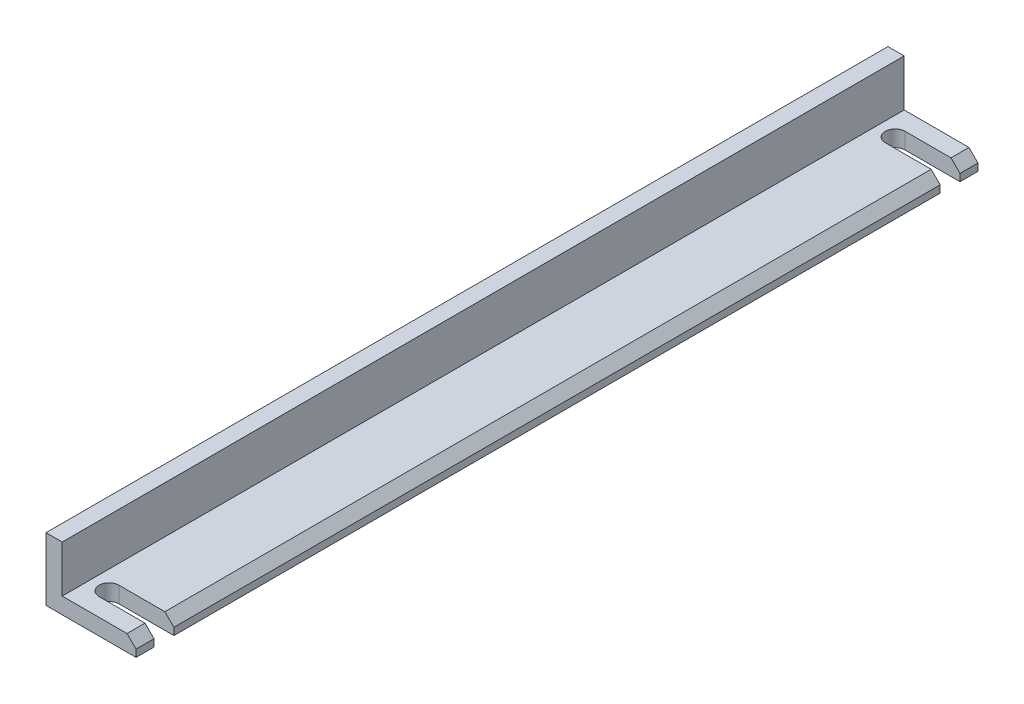
ISO-10303-21;
HEADER;
FILE_DESCRIPTION(('STEP AP214'),'2;1');
FILE_NAME('part.step','',(''),(''),'','','');
FILE_SCHEMA(('AUTOMOTIVE_DESIGN { 1 0 10303 214 1 1 1 1 }'));
ENDSEC;
DATA;
#1=APPLICATION_CONTEXT('core data for automotive mechanical design processes');
#2=APPLICATION_PROTOCOL_DEFINITION('international standard','automotive_design',2000,#1);
#3=PRODUCT_CONTEXT('',#1,'mechanical');
#4=PRODUCT('Part','Part','',(#3));
#5=PRODUCT_RELATED_PRODUCT_CATEGORY('part','',(#4));
#6=PRODUCT_DEFINITION_FORMATION('','',#4);
#7=PRODUCT_DEFINITION_CONTEXT('part definition',#1,'design');
#8=PRODUCT_DEFINITION('design','',#6,#7);
#9=PRODUCT_DEFINITION_SHAPE('','',#8);
#10=(LENGTH_UNIT() NAMED_UNIT(*) SI_UNIT(.MILLI.,.METRE.));
#11=(NAMED_UNIT(*) PLANE_ANGLE_UNIT() SI_UNIT($,.RADIAN.));
#12=(NAMED_UNIT(*) SI_UNIT($,.STERADIAN.) SOLID_ANGLE_UNIT());
#13=UNCERTAINTY_MEASURE_WITH_UNIT(LENGTH_MEASURE(1.E-05),#10,'distance_accuracy_value','');
#14=(GEOMETRIC_REPRESENTATION_CONTEXT(3) GLOBAL_UNCERTAINTY_ASSIGNED_CONTEXT((#13)) GLOBAL_UNIT_ASSIGNED_CONTEXT((#10,
#11,#12)) REPRESENTATION_CONTEXT('',''));
#15=CARTESIAN_POINT('',(0.,0.,0.));
#16=DIRECTION('',(0.,0.,1.));
#17=DIRECTION('',(1.,0.,0.));
#18=AXIS2_PLACEMENT_3D('',#15,#16,#17);
#19=CARTESIAN_POINT('',(0.,0.,46.75));
#20=DIRECTION('',(0.,1.,0.));
#21=DIRECTION('',(0.,0.,1.));
#22=AXIS2_PLACEMENT_3D('',#19,#20,#21);
#23=PLANE('',#22);
#24=DIRECTION('',(-1.,0.,0.));
#25=VECTOR('',#24,1.);
#26=CARTESIAN_POINT('',(0.,0.,-42.55));
#27=LINE('',#26,#25);
#28=CARTESIAN_POINT('',(10.,0.,-42.55));
#29=VERTEX_POINT('',#28);
#30=CARTESIAN_POINT('',(3.9,0.,-42.55));
#31=VERTEX_POINT('',#30);
#32=EDGE_CURVE('E190',#29,#31,#27,.T.);
#33=ORIENTED_EDGE('',*,*,#32,.F.);
#34=DIRECTION('',(0.,0.,-1.));
#35=VECTOR('',#34,1.);
#36=CARTESIAN_POINT('',(10.,0.,46.75));
#37=LINE('',#36,#35);
#38=CARTESIAN_POINT('',(10.,0.,42.55));
#39=VERTEX_POINT('',#38);
#40=EDGE_CURVE('E265',#39,#29,#37,.T.);
#41=ORIENTED_EDGE('',*,*,#40,.F.);
#42=DIRECTION('',(-1.,0.,0.));
#43=VECTOR('',#42,1.);
#44=CARTESIAN_POINT('',(0.,0.,42.55));
#45=LINE('',#44,#43);
#46=CARTESIAN_POINT('',(3.9,0.,42.55));
#47=VERTEX_POINT('',#46);
#48=EDGE_CURVE('E207',#39,#47,#45,.T.);
#49=ORIENTED_EDGE('',*,*,#48,.T.);
#50=CARTESIAN_POINT('',(3.9,0.,43.65));
#51=DIRECTION('',(0.,1.,0.));
#52=DIRECTION('',(0.,0.,1.));
#53=AXIS2_PLACEMENT_3D('',#50,#51,#52);
#54=CIRCLE('',#53,1.1);
#55=CARTESIAN_POINT('',(3.9,0.,44.75));
#56=VERTEX_POINT('',#55);
#57=EDGE_CURVE('E215',#47,#56,#54,.T.);
#58=ORIENTED_EDGE('',*,*,#57,.T.);
#59=DIRECTION('',(1.,0.,0.));
#60=VECTOR('',#59,1.);
#61=CARTESIAN_POINT('',(0.,0.,44.75));
#62=LINE('',#61,#60);
#63=CARTESIAN_POINT('',(10.,0.,44.75));
#64=VERTEX_POINT('',#63);
#65=EDGE_CURVE('E212',#56,#64,#62,.T.);
#66=ORIENTED_EDGE('',*,*,#65,.T.);
#67=CARTESIAN_POINT('',(10.,0.,46.75));
#68=VERTEX_POINT('',#67);
#69=EDGE_CURVE('E261',#68,#64,#37,.T.);
#70=ORIENTED_EDGE('',*,*,#69,.F.);
#71=DIRECTION('',(1.,0.,0.));
#72=VECTOR('',#71,1.);
#73=CARTESIAN_POINT('',(0.,0.,46.75));
#74=LINE('',#73,#72);
#75=CARTESIAN_POINT('',(0.,0.,46.75));
#76=VERTEX_POINT('',#75);
#77=EDGE_CURVE('E219',#76,#68,#74,.T.);
#78=ORIENTED_EDGE('',*,*,#77,.F.);
#79=DIRECTION('',(0.,0.,-1.));
#80=VECTOR('',#79,1.);
#81=CARTESIAN_POINT('',(0.,0.,46.75));
#82=LINE('',#81,#80);
#83=CARTESIAN_POINT('',(0.,0.,-46.75));
#84=VERTEX_POINT('',#83);
#85=EDGE_CURVE('E236',#76,#84,#82,.T.);
#86=ORIENTED_EDGE('',*,*,#85,.T.);
#87=DIRECTION('',(1.,0.,0.));
#88=VECTOR('',#87,1.);
#89=CARTESIAN_POINT('',(0.,0.,-46.75));
#90=LINE('',#89,#88);
#91=CARTESIAN_POINT('',(10.,0.,-46.75));
#92=VERTEX_POINT('',#91);
#93=EDGE_CURVE('E218',#84,#92,#90,.T.);
#94=ORIENTED_EDGE('',*,*,#93,.T.);
#95=CARTESIAN_POINT('',(10.,0.,-44.75));
#96=VERTEX_POINT('',#95);
#97=EDGE_CURVE('E260',#96,#92,#37,.T.);
#98=ORIENTED_EDGE('',*,*,#97,.F.);
#99=DIRECTION('',(1.,0.,0.));
#100=VECTOR('',#99,1.);
#101=CARTESIAN_POINT('',(0.,0.,-44.75));
#102=LINE('',#101,#100);
#103=CARTESIAN_POINT('',(3.9,0.,-44.75));
#104=VERTEX_POINT('',#103);
#105=EDGE_CURVE('E186',#104,#96,#102,.T.);
#106=ORIENTED_EDGE('',*,*,#105,.F.);
#107=CARTESIAN_POINT('',(3.9,0.,-43.65));
#108=DIRECTION('',(0.,1.,0.));
#109=DIRECTION('',(0.,0.,1.));
#110=AXIS2_PLACEMENT_3D('',#107,#108,#109);
#111=CIRCLE('',#110,1.1);
#112=EDGE_CURVE('E168',#31,#104,#111,.F.);
#113=ORIENTED_EDGE('',*,*,#112,.F.);
#114=EDGE_LOOP('',(#33,#41,#49,#58,#66,#70,#78,#86,#94,#98,#106,#113));
#115=FACE_BOUND('',#114,.T.);
#116=ADVANCED_FACE('F38',(#115),#23,.F.);
#117=CARTESIAN_POINT('',(10.,1.8,46.75));
#118=DIRECTION('',(1.,0.,0.));
#119=DIRECTION('',(0.,0.,-1.));
#120=AXIS2_PLACEMENT_3D('',#117,#118,#119);
#121=PLANE('',#120);
#122=ORIENTED_EDGE('',*,*,#40,.T.);
#123=DIRECTION('',(0.,1.,0.));
#124=VECTOR('',#123,1.);
#125=CARTESIAN_POINT('',(10.,1.8,-42.55));
#126=LINE('',#125,#124);
#127=CARTESIAN_POINT('',(10.,0.799999999999999,-42.55));
#128=VERTEX_POINT('',#127);
#129=EDGE_CURVE('E188',#29,#128,#126,.T.);
#130=ORIENTED_EDGE('',*,*,#129,.T.);
#131=DIRECTION('',(0.,0.,1.));
#132=VECTOR('',#131,1.);
#133=CARTESIAN_POINT('',(10.,0.799999999999999,46.75));
#134=LINE('',#133,#132);
#135=CARTESIAN_POINT('',(10.,0.799999999999999,42.55));
#136=VERTEX_POINT('',#135);
#137=EDGE_CURVE('E62',#128,#136,#134,.T.);
#138=ORIENTED_EDGE('',*,*,#137,.T.);
#139=DIRECTION('',(0.,1.,0.));
#140=VECTOR('',#139,1.);
#141=CARTESIAN_POINT('',(10.,1.8,42.55));
#142=LINE('',#141,#140);
#143=EDGE_CURVE('E204',#39,#136,#142,.T.);
#144=ORIENTED_EDGE('',*,*,#143,.F.);
#145=EDGE_LOOP('',(#122,#130,#138,#144));
#146=FACE_BOUND('',#145,.T.);
#147=ADVANCED_FACE('F319',(#146),#121,.T.);
#148=CARTESIAN_POINT('',(10.,0.799999999999999,-46.75));
#149=VERTEX_POINT('',#148);
#150=CARTESIAN_POINT('',(10.,0.799999999999999,-44.75));
#151=VERTEX_POINT('',#150);
#152=EDGE_CURVE('E273',#149,#151,#134,.T.);
#153=ORIENTED_EDGE('',*,*,#152,.T.);
#154=DIRECTION('',(0.,-1.,0.));
#155=VECTOR('',#154,1.);
#156=CARTESIAN_POINT('',(10.,1.8,-44.75));
#157=LINE('',#156,#155);
#158=EDGE_CURVE('E54',#151,#96,#157,.T.);
#159=ORIENTED_EDGE('',*,*,#158,.T.);
#160=ORIENTED_EDGE('',*,*,#97,.T.);
#161=DIRECTION('',(0.,-1.,0.));
#162=VECTOR('',#161,1.);
#163=CARTESIAN_POINT('',(10.,1.8,-46.75));
#164=LINE('',#163,#162);
#165=EDGE_CURVE('E239',#149,#92,#164,.T.);
#166=ORIENTED_EDGE('',*,*,#165,.F.);
#167=EDGE_LOOP('',(#153,#159,#160,#166));
#168=FACE_BOUND('',#167,.T.);
#169=ADVANCED_FACE('F287',(#168),#121,.T.);
#170=CARTESIAN_POINT('',(0.,1.8,46.75));
#171=DIRECTION('',(0.,1.,0.));
#172=DIRECTION('',(0.,0.,1.));
#173=AXIS2_PLACEMENT_3D('',#170,#171,#172);
#174=PLANE('',#173);
#175=DIRECTION('',(0.,0.,-1.));
#176=VECTOR('',#175,1.);
#177=CARTESIAN_POINT('',(9.,1.8,46.75));
#178=LINE('',#177,#176);
#179=CARTESIAN_POINT('',(9.,1.8,42.55));
#180=VERTEX_POINT('',#179);
#181=CARTESIAN_POINT('',(9.,1.8,-42.55));
#182=VERTEX_POINT('',#181);
#183=EDGE_CURVE('E270',#180,#182,#178,.T.);
#184=ORIENTED_EDGE('',*,*,#183,.T.);
#185=DIRECTION('',(-1.,0.,0.));
#186=VECTOR('',#185,1.);
#187=CARTESIAN_POINT('',(11.5225495708533,1.8,-42.55));
#188=LINE('',#187,#186);
#189=CARTESIAN_POINT('',(3.9,1.8,-42.55));
#190=VERTEX_POINT('',#189);
#191=EDGE_CURVE('E171',#182,#190,#188,.T.);
#192=ORIENTED_EDGE('',*,*,#191,.T.);
#193=CARTESIAN_POINT('',(3.9,1.8,-43.65));
#194=DIRECTION('',(0.,-1.,0.));
#195=DIRECTION('',(0.,0.,-1.));
#196=AXIS2_PLACEMENT_3D('',#193,#194,#195);
#197=CIRCLE('',#196,1.1);
#198=CARTESIAN_POINT('',(3.9,1.8,-44.75));
#199=VERTEX_POINT('',#198);
#200=EDGE_CURVE('E165',#190,#199,#197,.T.);
#201=ORIENTED_EDGE('',*,*,#200,.T.);
#202=DIRECTION('',(1.,0.,0.));
#203=VECTOR('',#202,1.);
#204=CARTESIAN_POINT('',(11.5225495708533,1.8,-44.75));
#205=LINE('',#204,#203);
#206=CARTESIAN_POINT('',(9.,1.8,-44.75));
#207=VERTEX_POINT('',#206);
#208=EDGE_CURVE('E174',#199,#207,#205,.T.);
#209=ORIENTED_EDGE('',*,*,#208,.T.);
#210=CARTESIAN_POINT('',(9.,1.8,-46.75));
#211=VERTEX_POINT('',#210);
#212=EDGE_CURVE('E264',#207,#211,#178,.T.);
#213=ORIENTED_EDGE('',*,*,#212,.T.);
#214=DIRECTION('',(1.,0.,0.));
#215=VECTOR('',#214,1.);
#216=CARTESIAN_POINT('',(0.,1.8,-46.75));
#217=LINE('',#216,#215);
#218=CARTESIAN_POINT('',(1.8,1.8,-46.75));
#219=VERTEX_POINT('',#218);
#220=EDGE_CURVE('E242',#219,#211,#217,.T.);
#221=ORIENTED_EDGE('',*,*,#220,.F.);
#222=DIRECTION('',(0.,0.,-1.));
#223=VECTOR('',#222,1.);
#224=CARTESIAN_POINT('',(1.8,1.8,46.75));
#225=LINE('',#224,#223);
#226=CARTESIAN_POINT('',(1.8,1.8,46.75));
#227=VERTEX_POINT('',#226);
#228=EDGE_CURVE('E258',#227,#219,#225,.T.);
#229=ORIENTED_EDGE('',*,*,#228,.F.);
#230=DIRECTION('',(1.,0.,0.));
#231=VECTOR('',#230,1.);
#232=CARTESIAN_POINT('',(0.,1.8,46.75));
#233=LINE('',#232,#231);
#234=CARTESIAN_POINT('',(9.,1.8,46.75));
#235=VERTEX_POINT('',#234);
#236=EDGE_CURVE('E225',#227,#235,#233,.T.);
#237=ORIENTED_EDGE('',*,*,#236,.T.);
#238=CARTESIAN_POINT('',(9.,1.8,44.75));
#239=VERTEX_POINT('',#238);
#240=EDGE_CURVE('E266',#235,#239,#178,.T.);
#241=ORIENTED_EDGE('',*,*,#240,.T.);
#242=DIRECTION('',(1.,0.,0.));
#243=VECTOR('',#242,1.);
#244=CARTESIAN_POINT('',(11.5225495708533,1.8,44.75));
#245=LINE('',#244,#243);
#246=CARTESIAN_POINT('',(3.9,1.8,44.75));
#247=VERTEX_POINT('',#246);
#248=EDGE_CURVE('E199',#247,#239,#245,.T.);
#249=ORIENTED_EDGE('',*,*,#248,.F.);
#250=CARTESIAN_POINT('',(3.9,1.8,43.65));
#251=DIRECTION('',(0.,1.,0.));
#252=DIRECTION('',(0.,0.,1.));
#253=AXIS2_PLACEMENT_3D('',#250,#251,#252);
#254=CIRCLE('',#253,1.1);
#255=CARTESIAN_POINT('',(3.9,1.8,42.55));
#256=VERTEX_POINT('',#255);
#257=EDGE_CURVE('E196',#256,#247,#254,.T.);
#258=ORIENTED_EDGE('',*,*,#257,.F.);
#259=DIRECTION('',(-1.,0.,0.));
#260=VECTOR('',#259,1.);
#261=CARTESIAN_POINT('',(11.5225495708533,1.8,42.55));
#262=LINE('',#261,#260);
#263=EDGE_CURVE('E193',#180,#256,#262,.T.);
#264=ORIENTED_EDGE('',*,*,#263,.F.);
#265=EDGE_LOOP('',(#184,#192,#201,#209,#213,#221,#229,#237,#241,#249,#258,#264));
#266=FACE_BOUND('',#265,.T.);
#267=ADVANCED_FACE('F180',(#266),#174,.T.);
#268=CARTESIAN_POINT('',(9.,1.8,46.75));
#269=DIRECTION('',(-0.707106781186547,-0.707106781186547,0.));
#270=DIRECTION('',(0.,0.,-1.));
#271=AXIS2_PLACEMENT_3D('',#268,#269,#270);
#272=PLANE('',#271);
#273=ORIENTED_EDGE('',*,*,#137,.F.);
#274=DIRECTION('',(0.707106781186548,-0.707106781186548,0.));
#275=VECTOR('',#274,1.);
#276=CARTESIAN_POINT('',(9.,1.8,-42.55));
#277=LINE('',#276,#275);
#278=EDGE_CURVE('E11',#128,#182,#277,.F.);
#279=ORIENTED_EDGE('',*,*,#278,.T.);
#280=ORIENTED_EDGE('',*,*,#183,.F.);
#281=DIRECTION('',(0.707106781186548,-0.707106781186548,0.));
#282=VECTOR('',#281,1.);
#283=CARTESIAN_POINT('',(9.,1.8,42.55));
#284=LINE('',#283,#282);
#285=EDGE_CURVE('E278',#136,#180,#284,.F.);
#286=ORIENTED_EDGE('',*,*,#285,.F.);
#287=EDGE_LOOP('',(#273,#279,#280,#286));
#288=FACE_BOUND('',#287,.T.);
#289=ADVANCED_FACE('F41',(#288),#272,.F.);
#290=ORIENTED_EDGE('',*,*,#212,.F.);
#291=DIRECTION('',(-0.707106781186548,0.707106781186548,0.));
#292=VECTOR('',#291,1.);
#293=CARTESIAN_POINT('',(9.,1.8,-44.75));
#294=LINE('',#293,#292);
#295=EDGE_CURVE('E47',#207,#151,#294,.F.);
#296=ORIENTED_EDGE('',*,*,#295,.T.);
#297=ORIENTED_EDGE('',*,*,#152,.F.);
#298=DIRECTION('',(-0.707106781186548,0.707106781186548,0.));
#299=VECTOR('',#298,1.);
#300=CARTESIAN_POINT('',(5.4,5.4,-46.75));
#301=LINE('',#300,#299);
#302=EDGE_CURVE('E269',#211,#149,#301,.F.);
#303=ORIENTED_EDGE('',*,*,#302,.F.);
#304=EDGE_LOOP('',(#290,#296,#297,#303));
#305=FACE_BOUND('',#304,.T.);
#306=ADVANCED_FACE('F283',(#305),#272,.F.);
#307=DIRECTION('',(0.,-1.,0.));
#308=VECTOR('',#307,1.);
#309=CARTESIAN_POINT('',(10.,1.8,44.75));
#310=LINE('',#309,#308);
#311=CARTESIAN_POINT('',(10.,0.799999999999999,44.75));
#312=VERTEX_POINT('',#311);
#313=EDGE_CURVE('E210',#312,#64,#310,.T.);
#314=ORIENTED_EDGE('',*,*,#313,.F.);
#315=CARTESIAN_POINT('',(10.,0.799999999999999,46.75));
#316=VERTEX_POINT('',#315);
#317=EDGE_CURVE('E272',#312,#316,#134,.T.);
#318=ORIENTED_EDGE('',*,*,#317,.T.);
#319=DIRECTION('',(0.,-1.,0.));
#320=VECTOR('',#319,1.);
#321=CARTESIAN_POINT('',(10.,1.8,46.75));
#322=LINE('',#321,#320);
#323=EDGE_CURVE('E222',#316,#68,#322,.T.);
#324=ORIENTED_EDGE('',*,*,#323,.T.);
#325=ORIENTED_EDGE('',*,*,#69,.T.);
#326=EDGE_LOOP('',(#314,#318,#324,#325));
#327=FACE_BOUND('',#326,.T.);
#328=ADVANCED_FACE('F333',(#327),#121,.T.);
#329=DIRECTION('',(-0.707106781186548,0.707106781186548,0.));
#330=VECTOR('',#329,1.);
#331=CARTESIAN_POINT('',(9.,1.8,44.75));
#332=LINE('',#331,#330);
#333=EDGE_CURVE('E280',#239,#312,#332,.F.);
#334=ORIENTED_EDGE('',*,*,#333,.F.);
#335=ORIENTED_EDGE('',*,*,#240,.F.);
#336=DIRECTION('',(0.707106781186548,-0.707106781186548,0.));
#337=VECTOR('',#336,1.);
#338=CARTESIAN_POINT('',(9.,1.8,46.75));
#339=LINE('',#338,#337);
#340=EDGE_CURVE('E276',#316,#235,#339,.F.);
#341=ORIENTED_EDGE('',*,*,#340,.F.);
#342=ORIENTED_EDGE('',*,*,#317,.F.);
#343=EDGE_LOOP('',(#334,#335,#341,#342));
#344=FACE_BOUND('',#343,.T.);
#345=ADVANCED_FACE('F341',(#344),#272,.F.);
#346=CARTESIAN_POINT('',(1.8,0.,46.75));
#347=DIRECTION('',(1.,0.,0.));
#348=DIRECTION('',(0.,0.,-1.));
#349=AXIS2_PLACEMENT_3D('',#346,#347,#348);
#350=PLANE('',#349);
#351=DIRECTION('',(0.,1.,0.));
#352=VECTOR('',#351,1.);
#353=CARTESIAN_POINT('',(1.8,0.,-46.75));
#354=LINE('',#353,#352);
#355=CARTESIAN_POINT('',(1.8,7.,-46.75));
#356=VERTEX_POINT('',#355);
#357=EDGE_CURVE('E245',#356,#219,#354,.F.);
#358=ORIENTED_EDGE('',*,*,#357,.F.);
#359=DIRECTION('',(0.,0.,-1.));
#360=VECTOR('',#359,1.);
#361=CARTESIAN_POINT('',(1.8,7.,46.75));
#362=LINE('',#361,#360);
#363=CARTESIAN_POINT('',(1.8,7.,46.75));
#364=VERTEX_POINT('',#363);
#365=EDGE_CURVE('E256',#364,#356,#362,.T.);
#366=ORIENTED_EDGE('',*,*,#365,.F.);
#367=DIRECTION('',(0.,1.,0.));
#368=VECTOR('',#367,1.);
#369=CARTESIAN_POINT('',(1.8,0.,46.75));
#370=LINE('',#369,#368);
#371=EDGE_CURVE('E228',#364,#227,#370,.F.);
#372=ORIENTED_EDGE('',*,*,#371,.T.);
#373=ORIENTED_EDGE('',*,*,#228,.T.);
#374=EDGE_LOOP('',(#358,#366,#372,#373));
#375=FACE_BOUND('',#374,.T.);
#376=ADVANCED_FACE('F308',(#375),#350,.T.);
#377=CARTESIAN_POINT('',(0.,7.,46.75));
#378=DIRECTION('',(0.,1.,0.));
#379=DIRECTION('',(0.,0.,1.));
#380=AXIS2_PLACEMENT_3D('',#377,#378,#379);
#381=PLANE('',#380);
#382=DIRECTION('',(1.,0.,0.));
#383=VECTOR('',#382,1.);
#384=CARTESIAN_POINT('',(0.,7.,-46.75));
#385=LINE('',#384,#383);
#386=CARTESIAN_POINT('',(0.,7.,-46.75));
#387=VERTEX_POINT('',#386);
#388=EDGE_CURVE('E248',#387,#356,#385,.T.);
#389=ORIENTED_EDGE('',*,*,#388,.F.);
#390=DIRECTION('',(0.,0.,-1.));
#391=VECTOR('',#390,1.);
#392=CARTESIAN_POINT('',(0.,7.,46.75));
#393=LINE('',#392,#391);
#394=CARTESIAN_POINT('',(0.,7.,46.75));
#395=VERTEX_POINT('',#394);
#396=EDGE_CURVE('E254',#395,#387,#393,.T.);
#397=ORIENTED_EDGE('',*,*,#396,.F.);
#398=DIRECTION('',(1.,0.,0.));
#399=VECTOR('',#398,1.);
#400=CARTESIAN_POINT('',(0.,7.,46.75));
#401=LINE('',#400,#399);
#402=EDGE_CURVE('E231',#395,#364,#401,.T.);
#403=ORIENTED_EDGE('',*,*,#402,.T.);
#404=ORIENTED_EDGE('',*,*,#365,.T.);
#405=EDGE_LOOP('',(#389,#397,#403,#404));
#406=FACE_BOUND('',#405,.T.);
#407=ADVANCED_FACE('F304',(#406),#381,.T.);
#408=CARTESIAN_POINT('',(0.,0.,46.75));
#409=DIRECTION('',(1.,0.,0.));
#410=DIRECTION('',(0.,0.,-1.));
#411=AXIS2_PLACEMENT_3D('',#408,#409,#410);
#412=PLANE('',#411);
#413=DIRECTION('',(0.,-1.,0.));
#414=VECTOR('',#413,1.);
#415=CARTESIAN_POINT('',(0.,0.,-46.75));
#416=LINE('',#415,#414);
#417=EDGE_CURVE('E223',#387,#84,#416,.T.);
#418=ORIENTED_EDGE('',*,*,#417,.T.);
#419=ORIENTED_EDGE('',*,*,#85,.F.);
#420=DIRECTION('',(0.,-1.,0.));
#421=VECTOR('',#420,1.);
#422=CARTESIAN_POINT('',(0.,0.,46.75));
#423=LINE('',#422,#421);
#424=EDGE_CURVE('E234',#395,#76,#423,.T.);
#425=ORIENTED_EDGE('',*,*,#424,.F.);
#426=ORIENTED_EDGE('',*,*,#396,.T.);
#427=EDGE_LOOP('',(#418,#419,#425,#426));
#428=FACE_BOUND('',#427,.T.);
#429=ADVANCED_FACE('F300',(#428),#412,.F.);
#430=CARTESIAN_POINT('',(0.,0.,46.75));
#431=DIRECTION('',(0.,0.,-1.));
#432=DIRECTION('',(-1.,0.,0.));
#433=AXIS2_PLACEMENT_3D('',#430,#431,#432);
#434=PLANE('',#433);
#435=ORIENTED_EDGE('',*,*,#323,.F.);
#436=ORIENTED_EDGE('',*,*,#340,.T.);
#437=ORIENTED_EDGE('',*,*,#236,.F.);
#438=ORIENTED_EDGE('',*,*,#371,.F.);
#439=ORIENTED_EDGE('',*,*,#402,.F.);
#440=ORIENTED_EDGE('',*,*,#424,.T.);
#441=ORIENTED_EDGE('',*,*,#77,.T.);
#442=EDGE_LOOP('',(#435,#436,#437,#438,#439,#440,#441));
#443=FACE_BOUND('',#442,.T.);
#444=ADVANCED_FACE('F338',(#443),#434,.F.);
#445=CARTESIAN_POINT('',(0.,0.,-46.75));
#446=DIRECTION('',(0.,0.,-1.));
#447=DIRECTION('',(-1.,0.,0.));
#448=AXIS2_PLACEMENT_3D('',#445,#446,#447);
#449=PLANE('',#448);
#450=ORIENTED_EDGE('',*,*,#220,.T.);
#451=ORIENTED_EDGE('',*,*,#302,.T.);
#452=ORIENTED_EDGE('',*,*,#165,.T.);
#453=ORIENTED_EDGE('',*,*,#93,.F.);
#454=ORIENTED_EDGE('',*,*,#417,.F.);
#455=ORIENTED_EDGE('',*,*,#388,.T.);
#456=ORIENTED_EDGE('',*,*,#357,.T.);
#457=EDGE_LOOP('',(#450,#451,#452,#453,#454,#455,#456));
#458=FACE_BOUND('',#457,.T.);
#459=ADVANCED_FACE('F291',(#458),#449,.T.);
#460=CARTESIAN_POINT('',(3.9,-8.2,43.65));
#461=DIRECTION('',(0.,1.,0.));
#462=DIRECTION('',(0.,0.,1.));
#463=AXIS2_PLACEMENT_3D('',#460,#461,#462);
#464=CYLINDRICAL_SURFACE('',#463,1.1);
#465=DIRECTION('',(0.,1.,0.));
#466=VECTOR('',#465,1.);
#467=CARTESIAN_POINT('',(3.9,-8.2,42.55));
#468=LINE('',#467,#466);
#469=EDGE_CURVE('E201',#47,#256,#468,.T.);
#470=ORIENTED_EDGE('',*,*,#469,.T.);
#471=ORIENTED_EDGE('',*,*,#257,.T.);
#472=DIRECTION('',(0.,1.,0.));
#473=VECTOR('',#472,1.);
#474=CARTESIAN_POINT('',(3.9,-8.2,44.75));
#475=LINE('',#474,#473);
#476=EDGE_CURVE('E202',#56,#247,#475,.T.);
#477=ORIENTED_EDGE('',*,*,#476,.F.);
#478=ORIENTED_EDGE('',*,*,#57,.F.);
#479=EDGE_LOOP('',(#470,#471,#477,#478));
#480=FACE_BOUND('',#479,.T.);
#481=ADVANCED_FACE('F325',(#480),#464,.F.);
#482=CARTESIAN_POINT('',(11.5225495708533,-8.2,44.75));
#483=DIRECTION('',(0.,0.,1.));
#484=DIRECTION('',(1.,0.,0.));
#485=AXIS2_PLACEMENT_3D('',#482,#483,#484);
#486=PLANE('',#485);
#487=ORIENTED_EDGE('',*,*,#476,.T.);
#488=ORIENTED_EDGE('',*,*,#248,.T.);
#489=ORIENTED_EDGE('',*,*,#333,.T.);
#490=ORIENTED_EDGE('',*,*,#313,.T.);
#491=ORIENTED_EDGE('',*,*,#65,.F.);
#492=EDGE_LOOP('',(#487,#488,#489,#490,#491));
#493=FACE_BOUND('',#492,.T.);
#494=ADVANCED_FACE('F329',(#493),#486,.F.);
#495=CARTESIAN_POINT('',(11.5225495708533,-8.2,42.55));
#496=DIRECTION('',(0.,0.,-1.));
#497=DIRECTION('',(-1.,0.,0.));
#498=AXIS2_PLACEMENT_3D('',#495,#496,#497);
#499=PLANE('',#498);
#500=ORIENTED_EDGE('',*,*,#143,.T.);
#501=ORIENTED_EDGE('',*,*,#285,.T.);
#502=ORIENTED_EDGE('',*,*,#263,.T.);
#503=ORIENTED_EDGE('',*,*,#469,.F.);
#504=ORIENTED_EDGE('',*,*,#48,.F.);
#505=EDGE_LOOP('',(#500,#501,#502,#503,#504));
#506=FACE_BOUND('',#505,.T.);
#507=ADVANCED_FACE('F323',(#506),#499,.F.);
#508=CARTESIAN_POINT('',(3.9,-8.2,-43.65));
#509=DIRECTION('',(0.,1.,0.));
#510=DIRECTION('',(0.,0.,1.));
#511=AXIS2_PLACEMENT_3D('',#508,#509,#510);
#512=CYLINDRICAL_SURFACE('',#511,1.1);
#513=ORIENTED_EDGE('',*,*,#112,.T.);
#514=DIRECTION('',(0.,1.,0.));
#515=VECTOR('',#514,1.);
#516=CARTESIAN_POINT('',(3.9,-8.2,-44.75));
#517=LINE('',#516,#515);
#518=EDGE_CURVE('E160',#104,#199,#517,.T.);
#519=ORIENTED_EDGE('',*,*,#518,.T.);
#520=ORIENTED_EDGE('',*,*,#200,.F.);
#521=DIRECTION('',(0.,1.,0.));
#522=VECTOR('',#521,1.);
#523=CARTESIAN_POINT('',(3.9,-8.2,-42.55));
#524=LINE('',#523,#522);
#525=EDGE_CURVE('E170',#31,#190,#524,.T.);
#526=ORIENTED_EDGE('',*,*,#525,.F.);
#527=EDGE_LOOP('',(#513,#519,#520,#526));
#528=FACE_BOUND('',#527,.T.);
#529=ADVANCED_FACE('F162',(#528),#512,.F.);
#530=CARTESIAN_POINT('',(11.5225495708533,-8.2,-42.55));
#531=DIRECTION('',(0.,0.,-1.));
#532=DIRECTION('',(-1.,0.,0.));
#533=AXIS2_PLACEMENT_3D('',#530,#531,#532);
#534=PLANE('',#533);
#535=ORIENTED_EDGE('',*,*,#32,.T.);
#536=ORIENTED_EDGE('',*,*,#525,.T.);
#537=ORIENTED_EDGE('',*,*,#191,.F.);
#538=ORIENTED_EDGE('',*,*,#278,.F.);
#539=ORIENTED_EDGE('',*,*,#129,.F.);
#540=EDGE_LOOP('',(#535,#536,#537,#538,#539));
#541=FACE_BOUND('',#540,.T.);
#542=ADVANCED_FACE('F317',(#541),#534,.T.);
#543=CARTESIAN_POINT('',(11.5225495708533,-8.2,-44.75));
#544=DIRECTION('',(0.,0.,1.));
#545=DIRECTION('',(1.,0.,0.));
#546=AXIS2_PLACEMENT_3D('',#543,#544,#545);
#547=PLANE('',#546);
#548=ORIENTED_EDGE('',*,*,#105,.T.);
#549=ORIENTED_EDGE('',*,*,#158,.F.);
#550=ORIENTED_EDGE('',*,*,#295,.F.);
#551=ORIENTED_EDGE('',*,*,#208,.F.);
#552=ORIENTED_EDGE('',*,*,#518,.F.);
#553=EDGE_LOOP('',(#548,#549,#550,#551,#552));
#554=FACE_BOUND('',#553,.T.);
#555=ADVANCED_FACE('F175',(#554),#547,.T.);
#556=CLOSED_SHELL('',(#116,#147,#169,#267,#289,#306,#328,#345,#376,#407,#429,#444,#459,#481,
#494,#507,#529,#542,#555));
#557=MANIFOLD_SOLID_BREP('B2',#556);
#558=ADVANCED_BREP_SHAPE_REPRESENTATION('',(#18,#557),#14);
#559=SHAPE_DEFINITION_REPRESENTATION(#9,#558);
ENDSEC;
END-ISO-10303-21;
